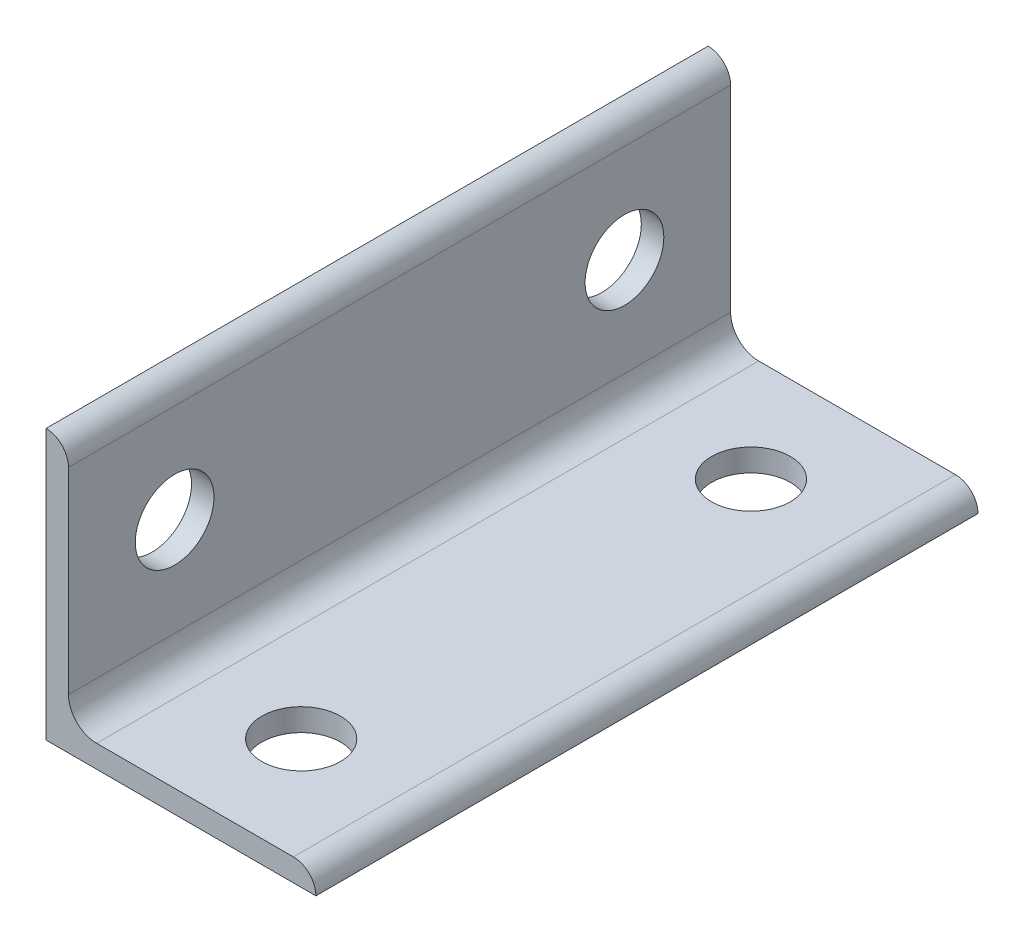
ISO-10303-21;
HEADER;
FILE_DESCRIPTION(('STEP AP214'),'2;1');
FILE_NAME('part.step','',(''),(''),'','','');
FILE_SCHEMA(('AUTOMOTIVE_DESIGN { 1 0 10303 214 1 1 1 1 }'));
ENDSEC;
DATA;
#1=APPLICATION_CONTEXT('core data for automotive mechanical design processes');
#2=APPLICATION_PROTOCOL_DEFINITION('international standard','automotive_design',2000,#1);
#3=PRODUCT_CONTEXT('',#1,'mechanical');
#4=PRODUCT('Part','Part','',(#3));
#5=PRODUCT_RELATED_PRODUCT_CATEGORY('part','',(#4));
#6=PRODUCT_DEFINITION_FORMATION('','',#4);
#7=PRODUCT_DEFINITION_CONTEXT('part definition',#1,'design');
#8=PRODUCT_DEFINITION('design','',#6,#7);
#9=PRODUCT_DEFINITION_SHAPE('','',#8);
#10=(LENGTH_UNIT() NAMED_UNIT(*) SI_UNIT(.MILLI.,.METRE.));
#11=(NAMED_UNIT(*) PLANE_ANGLE_UNIT() SI_UNIT($,.RADIAN.));
#12=(NAMED_UNIT(*) SI_UNIT($,.STERADIAN.) SOLID_ANGLE_UNIT());
#13=UNCERTAINTY_MEASURE_WITH_UNIT(LENGTH_MEASURE(1.E-05),#10,'distance_accuracy_value','');
#14=(GEOMETRIC_REPRESENTATION_CONTEXT(3) GLOBAL_UNCERTAINTY_ASSIGNED_CONTEXT((#13)) GLOBAL_UNIT_ASSIGNED_CONTEXT((#10,
#11,#12)) REPRESENTATION_CONTEXT('',''));
#15=CARTESIAN_POINT('',(0.,0.,0.));
#16=DIRECTION('',(0.,0.,1.));
#17=DIRECTION('',(1.,0.,0.));
#18=AXIS2_PLACEMENT_3D('',#15,#16,#17);
#19=CARTESIAN_POINT('',(2000.98702540289,100.584,-186.944));
#20=DIRECTION('',(0.,0.,-1.));
#21=DIRECTION('',(0.,1.,0.));
#22=AXIS2_PLACEMENT_3D('',#19,#20,#21);
#23=PLANE('',#22);
#24=DIRECTION('',(1.,0.,0.));
#25=VECTOR('',#24,1.);
#26=CARTESIAN_POINT('',(-47.62501925,0.,-186.944));
#27=LINE('',#26,#25);
#28=CARTESIAN_POINT('',(-47.62501925,0.,-186.944));
#29=VERTEX_POINT('',#28);
#30=CARTESIAN_POINT('',(28.57498075,0.,-186.944));
#31=VERTEX_POINT('',#30);
#32=EDGE_CURVE('E48',#29,#31,#27,.T.);
#33=ORIENTED_EDGE('',*,*,#32,.F.);
#34=DIRECTION('',(0.,-1.,0.));
#35=VECTOR('',#34,1.);
#36=CARTESIAN_POINT('',(-47.62501925,0.,-186.944));
#37=LINE('',#36,#35);
#38=CARTESIAN_POINT('',(-47.62501925,76.2,-186.944));
#39=VERTEX_POINT('',#38);
#40=EDGE_CURVE('E144',#39,#29,#37,.T.);
#41=ORIENTED_EDGE('',*,*,#40,.F.);
#42=CARTESIAN_POINT('',(-47.62501925,69.85,-186.944));
#43=DIRECTION('',(0.,0.,-1.));
#44=DIRECTION('',(0.,1.,0.));
#45=AXIS2_PLACEMENT_3D('',#42,#43,#44);
#46=CIRCLE('',#45,6.34999999999999);
#47=CARTESIAN_POINT('',(-41.27501925,69.85,-186.944));
#48=VERTEX_POINT('',#47);
#49=EDGE_CURVE('E149',#48,#39,#46,.F.);
#50=ORIENTED_EDGE('',*,*,#49,.F.);
#51=DIRECTION('',(0.,1.,0.));
#52=VECTOR('',#51,1.);
#53=CARTESIAN_POINT('',(-41.27501925,69.85,-186.944));
#54=LINE('',#53,#52);
#55=CARTESIAN_POINT('',(-41.27501925,14.2875,-186.944));
#56=VERTEX_POINT('',#55);
#57=EDGE_CURVE('E154',#56,#48,#54,.T.);
#58=ORIENTED_EDGE('',*,*,#57,.F.);
#59=CARTESIAN_POINT('',(-33.33751925,14.2875,-186.944));
#60=DIRECTION('',(0.,0.,-1.));
#61=DIRECTION('',(0.,1.,0.));
#62=AXIS2_PLACEMENT_3D('',#59,#60,#61);
#63=CIRCLE('',#62,7.93750000000001);
#64=CARTESIAN_POINT('',(-33.33751925,6.34999999999999,-186.944));
#65=VERTEX_POINT('',#64);
#66=EDGE_CURVE('E86',#65,#56,#63,.T.);
#67=ORIENTED_EDGE('',*,*,#66,.F.);
#68=DIRECTION('',(-1.,0.,0.));
#69=VECTOR('',#68,1.);
#70=CARTESIAN_POINT('',(22.22498075,6.35,-186.944));
#71=LINE('',#70,#69);
#72=CARTESIAN_POINT('',(22.22498075,6.35,-186.944));
#73=VERTEX_POINT('',#72);
#74=EDGE_CURVE('E91',#73,#65,#71,.T.);
#75=ORIENTED_EDGE('',*,*,#74,.F.);
#76=CARTESIAN_POINT('',(22.22498075,0.,-186.944));
#77=DIRECTION('',(0.,0.,-1.));
#78=DIRECTION('',(0.,1.,0.));
#79=AXIS2_PLACEMENT_3D('',#76,#77,#78);
#80=CIRCLE('',#79,6.35);
#81=EDGE_CURVE('E119',#31,#73,#80,.F.);
#82=ORIENTED_EDGE('',*,*,#81,.F.);
#83=EDGE_LOOP('',(#33,#41,#50,#58,#67,#75,#82));
#84=FACE_BOUND('',#83,.T.);
#85=ADVANCED_FACE('F39',(#84),#23,.T.);
#86=CARTESIAN_POINT('',(22.22498075,0.,0.));
#87=DIRECTION('',(0.,0.,-1.));
#88=DIRECTION('',(-1.,0.,0.));
#89=AXIS2_PLACEMENT_3D('',#86,#87,#88);
#90=PLANE('',#89);
#91=DIRECTION('',(1.,0.,0.));
#92=VECTOR('',#91,1.);
#93=CARTESIAN_POINT('',(-47.62501925,0.,0.));
#94=LINE('',#93,#92);
#95=CARTESIAN_POINT('',(-47.62501925,0.,0.));
#96=VERTEX_POINT('',#95);
#97=CARTESIAN_POINT('',(28.57498075,0.,0.));
#98=VERTEX_POINT('',#97);
#99=EDGE_CURVE('E131',#96,#98,#94,.T.);
#100=ORIENTED_EDGE('',*,*,#99,.T.);
#101=CARTESIAN_POINT('',(22.22498075,0.,0.));
#102=DIRECTION('',(0.,0.,1.));
#103=DIRECTION('',(-1.,0.,0.));
#104=AXIS2_PLACEMENT_3D('',#101,#102,#103);
#105=CIRCLE('',#104,6.35);
#106=CARTESIAN_POINT('',(22.22498075,6.35,0.));
#107=VERTEX_POINT('',#106);
#108=EDGE_CURVE('E117',#98,#107,#105,.T.);
#109=ORIENTED_EDGE('',*,*,#108,.T.);
#110=DIRECTION('',(-1.,0.,0.));
#111=VECTOR('',#110,1.);
#112=CARTESIAN_POINT('',(22.22498075,6.35,0.));
#113=LINE('',#112,#111);
#114=CARTESIAN_POINT('',(-33.33751925,6.34999999999998,0.));
#115=VERTEX_POINT('',#114);
#116=EDGE_CURVE('E122',#107,#115,#113,.T.);
#117=ORIENTED_EDGE('',*,*,#116,.T.);
#118=CARTESIAN_POINT('',(-33.33751925,14.2875,0.));
#119=DIRECTION('',(0.,0.,-1.));
#120=DIRECTION('',(1.,0.,0.));
#121=AXIS2_PLACEMENT_3D('',#118,#119,#120);
#122=CIRCLE('',#121,7.93750000000001);
#123=CARTESIAN_POINT('',(-41.27501925,14.2875,0.));
#124=VERTEX_POINT('',#123);
#125=EDGE_CURVE('E127',#115,#124,#122,.T.);
#126=ORIENTED_EDGE('',*,*,#125,.T.);
#127=DIRECTION('',(0.,1.,0.));
#128=VECTOR('',#127,1.);
#129=CARTESIAN_POINT('',(-41.27501925,69.85,0.));
#130=LINE('',#129,#128);
#131=CARTESIAN_POINT('',(-41.27501925,69.85,0.));
#132=VERTEX_POINT('',#131);
#133=EDGE_CURVE('E210',#124,#132,#130,.T.);
#134=ORIENTED_EDGE('',*,*,#133,.T.);
#135=CARTESIAN_POINT('',(-47.62501925,69.85,0.));
#136=DIRECTION('',(0.,0.,1.));
#137=DIRECTION('',(1.,0.,0.));
#138=AXIS2_PLACEMENT_3D('',#135,#136,#137);
#139=CIRCLE('',#138,6.34999999999999);
#140=CARTESIAN_POINT('',(-47.62501925,76.2,0.));
#141=VERTEX_POINT('',#140);
#142=EDGE_CURVE('E206',#132,#141,#139,.T.);
#143=ORIENTED_EDGE('',*,*,#142,.T.);
#144=DIRECTION('',(0.,-1.,0.));
#145=VECTOR('',#144,1.);
#146=CARTESIAN_POINT('',(-47.62501925,0.,0.));
#147=LINE('',#146,#145);
#148=EDGE_CURVE('E141',#141,#96,#147,.T.);
#149=ORIENTED_EDGE('',*,*,#148,.T.);
#150=EDGE_LOOP('',(#100,#109,#117,#126,#134,#143,#149));
#151=FACE_BOUND('',#150,.T.);
#152=ADVANCED_FACE('F129',(#151),#90,.F.);
#153=CARTESIAN_POINT('',(22.22498075,0.,-294.70707345283));
#154=DIRECTION('',(0.,0.,1.));
#155=DIRECTION('',(1.,0.,0.));
#156=AXIS2_PLACEMENT_3D('',#153,#154,#155);
#157=CYLINDRICAL_SURFACE('',#156,6.35);
#158=DIRECTION('',(0.,0.,1.));
#159=VECTOR('',#158,1.);
#160=CARTESIAN_POINT('',(28.57498075,0.,-294.70707345283));
#161=LINE('',#160,#159);
#162=EDGE_CURVE('E11',#31,#98,#161,.T.);
#163=ORIENTED_EDGE('',*,*,#162,.F.);
#164=ORIENTED_EDGE('',*,*,#81,.T.);
#165=DIRECTION('',(0.,0.,1.));
#166=VECTOR('',#165,1.);
#167=CARTESIAN_POINT('',(22.22498075,6.35,-294.70707345283));
#168=LINE('',#167,#166);
#169=EDGE_CURVE('E114',#73,#107,#168,.T.);
#170=ORIENTED_EDGE('',*,*,#169,.T.);
#171=ORIENTED_EDGE('',*,*,#108,.F.);
#172=EDGE_LOOP('',(#163,#164,#170,#171));
#173=FACE_BOUND('',#172,.T.);
#174=ADVANCED_FACE('F115',(#173),#157,.T.);
#175=CARTESIAN_POINT('',(22.22498075,6.35,-294.70707345283));
#176=DIRECTION('',(0.,1.,0.));
#177=DIRECTION('',(-1.,0.,0.));
#178=AXIS2_PLACEMENT_3D('',#175,#176,#177);
#179=PLANE('',#178);
#180=CARTESIAN_POINT('',(-5.55626924999999,6.35,-29.9719999999999));
#181=DIRECTION('',(0.,1.,0.));
#182=DIRECTION('',(-1.,0.,0.));
#183=AXIS2_PLACEMENT_3D('',#180,#181,#182);
#184=CIRCLE('',#183,11.1125);
#185=CARTESIAN_POINT('',(-16.66876925,6.34999999999999,-29.9719999999999));
#186=VERTEX_POINT('',#185);
#187=EDGE_CURVE('E172',#186,#186,#184,.T.);
#188=ORIENTED_EDGE('',*,*,#187,.F.);
#189=EDGE_LOOP('',(#188));
#190=FACE_BOUND('',#189,.T.);
#191=CARTESIAN_POINT('',(-5.55626924999999,6.35,-156.972));
#192=DIRECTION('',(0.,1.,0.));
#193=DIRECTION('',(-1.,0.,0.));
#194=AXIS2_PLACEMENT_3D('',#191,#192,#193);
#195=CIRCLE('',#194,11.1125);
#196=CARTESIAN_POINT('',(-16.66876925,6.34999999999999,-156.972));
#197=VERTEX_POINT('',#196);
#198=EDGE_CURVE('E181',#197,#197,#195,.T.);
#199=ORIENTED_EDGE('',*,*,#198,.F.);
#200=EDGE_LOOP('',(#199));
#201=FACE_BOUND('',#200,.T.);
#202=ORIENTED_EDGE('',*,*,#169,.F.);
#203=ORIENTED_EDGE('',*,*,#74,.T.);
#204=DIRECTION('',(0.,0.,1.));
#205=VECTOR('',#204,1.);
#206=CARTESIAN_POINT('',(-33.33751925,6.34999999999998,-294.70707345283));
#207=LINE('',#206,#205);
#208=EDGE_CURVE('E109',#65,#115,#207,.T.);
#209=ORIENTED_EDGE('',*,*,#208,.T.);
#210=ORIENTED_EDGE('',*,*,#116,.F.);
#211=EDGE_LOOP('',(#202,#203,#209,#210));
#212=FACE_BOUND('',#211,.T.);
#213=ADVANCED_FACE('F123',(#190,#201,#212),#179,.T.);
#214=CARTESIAN_POINT('',(-33.33751925,14.2875,-294.70707345283));
#215=DIRECTION('',(0.,0.,1.));
#216=DIRECTION('',(1.,0.,0.));
#217=AXIS2_PLACEMENT_3D('',#214,#215,#216);
#218=CYLINDRICAL_SURFACE('',#217,7.93750000000001);
#219=ORIENTED_EDGE('',*,*,#208,.F.);
#220=ORIENTED_EDGE('',*,*,#66,.T.);
#221=DIRECTION('',(0.,0.,1.));
#222=VECTOR('',#221,1.);
#223=CARTESIAN_POINT('',(-41.27501925,14.2875,-294.70707345283));
#224=LINE('',#223,#222);
#225=EDGE_CURVE('E158',#56,#124,#224,.T.);
#226=ORIENTED_EDGE('',*,*,#225,.T.);
#227=ORIENTED_EDGE('',*,*,#125,.F.);
#228=EDGE_LOOP('',(#219,#220,#226,#227));
#229=FACE_BOUND('',#228,.T.);
#230=ADVANCED_FACE('F216',(#229),#218,.F.);
#231=CARTESIAN_POINT('',(-41.27501925,69.85,-294.70707345283));
#232=DIRECTION('',(1.,0.,0.));
#233=DIRECTION('',(0.,0.,-1.));
#234=AXIS2_PLACEMENT_3D('',#231,#232,#233);
#235=PLANE('',#234);
#236=CARTESIAN_POINT('',(-41.27501925,42.06875,-29.972));
#237=DIRECTION('',(1.,0.,0.));
#238=DIRECTION('',(0.,0.,-1.));
#239=AXIS2_PLACEMENT_3D('',#236,#237,#238);
#240=CIRCLE('',#239,11.1125);
#241=CARTESIAN_POINT('',(-41.27501925,42.06875,-41.0845));
#242=VERTEX_POINT('',#241);
#243=EDGE_CURVE('E190',#242,#242,#240,.T.);
#244=ORIENTED_EDGE('',*,*,#243,.F.);
#245=EDGE_LOOP('',(#244));
#246=FACE_BOUND('',#245,.T.);
#247=CARTESIAN_POINT('',(-41.27501925,42.06875,-156.972));
#248=DIRECTION('',(1.,0.,0.));
#249=DIRECTION('',(0.,0.,-1.));
#250=AXIS2_PLACEMENT_3D('',#247,#248,#249);
#251=CIRCLE('',#250,11.1125);
#252=CARTESIAN_POINT('',(-41.27501925,42.06875,-168.0845));
#253=VERTEX_POINT('',#252);
#254=EDGE_CURVE('E135',#253,#253,#251,.T.);
#255=ORIENTED_EDGE('',*,*,#254,.F.);
#256=EDGE_LOOP('',(#255));
#257=FACE_BOUND('',#256,.T.);
#258=ORIENTED_EDGE('',*,*,#225,.F.);
#259=ORIENTED_EDGE('',*,*,#57,.T.);
#260=DIRECTION('',(0.,0.,1.));
#261=VECTOR('',#260,1.);
#262=CARTESIAN_POINT('',(-41.27501925,69.85,-294.70707345283));
#263=LINE('',#262,#261);
#264=EDGE_CURVE('E153',#48,#132,#263,.T.);
#265=ORIENTED_EDGE('',*,*,#264,.T.);
#266=ORIENTED_EDGE('',*,*,#133,.F.);
#267=EDGE_LOOP('',(#258,#259,#265,#266));
#268=FACE_BOUND('',#267,.T.);
#269=ADVANCED_FACE('F219',(#246,#257,#268),#235,.T.);
#270=CARTESIAN_POINT('',(-47.62501925,69.85,-294.70707345283));
#271=DIRECTION('',(0.,0.,1.));
#272=DIRECTION('',(1.,0.,0.));
#273=AXIS2_PLACEMENT_3D('',#270,#271,#272);
#274=CYLINDRICAL_SURFACE('',#273,6.34999999999999);
#275=ORIENTED_EDGE('',*,*,#264,.F.);
#276=ORIENTED_EDGE('',*,*,#49,.T.);
#277=DIRECTION('',(0.,0.,1.));
#278=VECTOR('',#277,1.);
#279=CARTESIAN_POINT('',(-47.62501925,76.2,-294.70707345283));
#280=LINE('',#279,#278);
#281=EDGE_CURVE('E148',#39,#141,#280,.T.);
#282=ORIENTED_EDGE('',*,*,#281,.T.);
#283=ORIENTED_EDGE('',*,*,#142,.F.);
#284=EDGE_LOOP('',(#275,#276,#282,#283));
#285=FACE_BOUND('',#284,.T.);
#286=ADVANCED_FACE('F223',(#285),#274,.T.);
#287=CARTESIAN_POINT('',(-47.62501925,0.,-294.70707345283));
#288=DIRECTION('',(-1.,0.,0.));
#289=DIRECTION('',(0.,-1.,0.));
#290=AXIS2_PLACEMENT_3D('',#287,#288,#289);
#291=PLANE('',#290);
#292=CARTESIAN_POINT('',(-47.62501925,42.06875,-29.972));
#293=DIRECTION('',(-1.,0.,0.));
#294=DIRECTION('',(0.,-1.,0.));
#295=AXIS2_PLACEMENT_3D('',#292,#293,#294);
#296=CIRCLE('',#295,11.1125);
#297=CARTESIAN_POINT('',(-47.62501925,42.06875,-41.0845));
#298=VERTEX_POINT('',#297);
#299=EDGE_CURVE('E184',#298,#298,#296,.F.);
#300=ORIENTED_EDGE('',*,*,#299,.T.);
#301=EDGE_LOOP('',(#300));
#302=FACE_BOUND('',#301,.T.);
#303=CARTESIAN_POINT('',(-47.62501925,42.06875,-156.972));
#304=DIRECTION('',(-1.,0.,0.));
#305=DIRECTION('',(0.,-1.,0.));
#306=AXIS2_PLACEMENT_3D('',#303,#304,#305);
#307=CIRCLE('',#306,11.1125);
#308=CARTESIAN_POINT('',(-47.62501925,42.06875,-168.0845));
#309=VERTEX_POINT('',#308);
#310=EDGE_CURVE('E196',#309,#309,#307,.F.);
#311=ORIENTED_EDGE('',*,*,#310,.T.);
#312=EDGE_LOOP('',(#311));
#313=FACE_BOUND('',#312,.T.);
#314=ORIENTED_EDGE('',*,*,#281,.F.);
#315=ORIENTED_EDGE('',*,*,#40,.T.);
#316=DIRECTION('',(0.,0.,1.));
#317=VECTOR('',#316,1.);
#318=CARTESIAN_POINT('',(-47.62501925,0.,-294.70707345283));
#319=LINE('',#318,#317);
#320=EDGE_CURVE('E143',#29,#96,#319,.T.);
#321=ORIENTED_EDGE('',*,*,#320,.T.);
#322=ORIENTED_EDGE('',*,*,#148,.F.);
#323=EDGE_LOOP('',(#314,#315,#321,#322));
#324=FACE_BOUND('',#323,.T.);
#325=ADVANCED_FACE('F227',(#302,#313,#324),#291,.T.);
#326=CARTESIAN_POINT('',(-47.62501925,0.,-294.70707345283));
#327=DIRECTION('',(0.,-1.,0.));
#328=DIRECTION('',(1.,0.,0.));
#329=AXIS2_PLACEMENT_3D('',#326,#327,#328);
#330=PLANE('',#329);
#331=CARTESIAN_POINT('',(-5.55626924999999,0.,-29.9719999999999));
#332=DIRECTION('',(0.,-1.,0.));
#333=DIRECTION('',(1.,0.,0.));
#334=AXIS2_PLACEMENT_3D('',#331,#332,#333);
#335=CIRCLE('',#334,11.1125);
#336=CARTESIAN_POINT('',(-16.66876925,0.,-29.9719999999999));
#337=VERTEX_POINT('',#336);
#338=EDGE_CURVE('E174',#337,#337,#335,.F.);
#339=ORIENTED_EDGE('',*,*,#338,.T.);
#340=EDGE_LOOP('',(#339));
#341=FACE_BOUND('',#340,.T.);
#342=CARTESIAN_POINT('',(-5.55626924999999,0.,-156.972));
#343=DIRECTION('',(0.,-1.,0.));
#344=DIRECTION('',(1.,0.,0.));
#345=AXIS2_PLACEMENT_3D('',#342,#343,#344);
#346=CIRCLE('',#345,11.1125);
#347=CARTESIAN_POINT('',(-16.66876925,0.,-156.972));
#348=VERTEX_POINT('',#347);
#349=EDGE_CURVE('E178',#348,#348,#346,.F.);
#350=ORIENTED_EDGE('',*,*,#349,.T.);
#351=EDGE_LOOP('',(#350));
#352=FACE_BOUND('',#351,.T.);
#353=ORIENTED_EDGE('',*,*,#320,.F.);
#354=ORIENTED_EDGE('',*,*,#32,.T.);
#355=ORIENTED_EDGE('',*,*,#162,.T.);
#356=ORIENTED_EDGE('',*,*,#99,.F.);
#357=EDGE_LOOP('',(#353,#354,#355,#356));
#358=FACE_BOUND('',#357,.T.);
#359=ADVANCED_FACE('F229',(#341,#352,#358),#330,.T.);
#360=CARTESIAN_POINT('',(-47.62601925,42.06875,-156.972));
#361=DIRECTION('',(1.,0.,0.));
#362=DIRECTION('',(0.,0.,-1.));
#363=AXIS2_PLACEMENT_3D('',#360,#361,#362);
#364=CYLINDRICAL_SURFACE('',#363,11.1125);
#365=CARTESIAN_POINT('',(-47.62501925,42.06875,-168.0845));
#366=CARTESIAN_POINT('',(-47.5588734166667,42.06875,-168.0845));
#367=CARTESIAN_POINT('',(-47.4927275833333,42.06875,-168.0845));
#368=CARTESIAN_POINT('',(-47.3604359166667,42.06875,-168.0845));
#369=CARTESIAN_POINT('',(-47.2942900833333,42.06875,-168.0845));
#370=CARTESIAN_POINT('',(-47.1619984166667,42.06875,-168.0845));
#371=CARTESIAN_POINT('',(-47.0958525833333,42.06875,-168.0845));
#372=CARTESIAN_POINT('',(-46.9635609166667,42.06875,-168.0845));
#373=CARTESIAN_POINT('',(-46.8974150833333,42.06875,-168.0845));
#374=CARTESIAN_POINT('',(-46.7651234166667,42.06875,-168.0845));
#375=CARTESIAN_POINT('',(-46.6989775833333,42.06875,-168.0845));
#376=CARTESIAN_POINT('',(-46.5666859166667,42.06875,-168.0845));
#377=CARTESIAN_POINT('',(-46.5005400833333,42.06875,-168.0845));
#378=CARTESIAN_POINT('',(-46.3682484166667,42.06875,-168.0845));
#379=CARTESIAN_POINT('',(-46.3021025833333,42.06875,-168.0845));
#380=CARTESIAN_POINT('',(-46.1698109166667,42.06875,-168.0845));
#381=CARTESIAN_POINT('',(-46.1036650833333,42.06875,-168.0845));
#382=CARTESIAN_POINT('',(-45.9713734166667,42.06875,-168.0845));
#383=CARTESIAN_POINT('',(-45.9052275833333,42.06875,-168.0845));
#384=CARTESIAN_POINT('',(-45.7729359166667,42.06875,-168.0845));
#385=CARTESIAN_POINT('',(-45.7067900833333,42.06875,-168.0845));
#386=CARTESIAN_POINT('',(-45.5744984166667,42.06875,-168.0845));
#387=CARTESIAN_POINT('',(-45.5083525833333,42.06875,-168.0845));
#388=CARTESIAN_POINT('',(-45.3760609166667,42.06875,-168.0845));
#389=CARTESIAN_POINT('',(-45.3099150833333,42.06875,-168.0845));
#390=CARTESIAN_POINT('',(-45.1776234166667,42.06875,-168.0845));
#391=CARTESIAN_POINT('',(-45.1114775833333,42.06875,-168.0845));
#392=CARTESIAN_POINT('',(-44.9791859166667,42.06875,-168.0845));
#393=CARTESIAN_POINT('',(-44.9130400833333,42.06875,-168.0845));
#394=CARTESIAN_POINT('',(-44.7807484166667,42.06875,-168.0845));
#395=CARTESIAN_POINT('',(-44.7146025833333,42.06875,-168.0845));
#396=CARTESIAN_POINT('',(-44.5823109166667,42.06875,-168.0845));
#397=CARTESIAN_POINT('',(-44.5161650833333,42.06875,-168.0845));
#398=CARTESIAN_POINT('',(-44.3838734166667,42.06875,-168.0845));
#399=CARTESIAN_POINT('',(-44.3177275833333,42.06875,-168.0845));
#400=CARTESIAN_POINT('',(-44.1854359166667,42.06875,-168.0845));
#401=CARTESIAN_POINT('',(-44.1192900833333,42.06875,-168.0845));
#402=CARTESIAN_POINT('',(-43.9869984166667,42.06875,-168.0845));
#403=CARTESIAN_POINT('',(-43.9208525833333,42.06875,-168.0845));
#404=CARTESIAN_POINT('',(-43.7885609166667,42.06875,-168.0845));
#405=CARTESIAN_POINT('',(-43.7224150833333,42.06875,-168.0845));
#406=CARTESIAN_POINT('',(-43.5901234166667,42.06875,-168.0845));
#407=CARTESIAN_POINT('',(-43.5239775833333,42.06875,-168.0845));
#408=CARTESIAN_POINT('',(-43.3916859166667,42.06875,-168.0845));
#409=CARTESIAN_POINT('',(-43.3255400833333,42.06875,-168.0845));
#410=CARTESIAN_POINT('',(-43.1932484166667,42.06875,-168.0845));
#411=CARTESIAN_POINT('',(-43.1271025833333,42.06875,-168.0845));
#412=CARTESIAN_POINT('',(-42.9948109166667,42.06875,-168.0845));
#413=CARTESIAN_POINT('',(-42.9286650833333,42.06875,-168.0845));
#414=CARTESIAN_POINT('',(-42.7963734166667,42.06875,-168.0845));
#415=CARTESIAN_POINT('',(-42.7302275833333,42.06875,-168.0845));
#416=CARTESIAN_POINT('',(-42.5979359166667,42.06875,-168.0845));
#417=CARTESIAN_POINT('',(-42.5317900833333,42.06875,-168.0845));
#418=CARTESIAN_POINT('',(-42.3994984166667,42.06875,-168.0845));
#419=CARTESIAN_POINT('',(-42.3333525833333,42.06875,-168.0845));
#420=CARTESIAN_POINT('',(-42.2010609166667,42.06875,-168.0845));
#421=CARTESIAN_POINT('',(-42.1349150833333,42.06875,-168.0845));
#422=CARTESIAN_POINT('',(-42.0026234166667,42.06875,-168.0845));
#423=CARTESIAN_POINT('',(-41.9364775833333,42.06875,-168.0845));
#424=CARTESIAN_POINT('',(-41.8041859166667,42.06875,-168.0845));
#425=CARTESIAN_POINT('',(-41.7380400833333,42.06875,-168.0845));
#426=CARTESIAN_POINT('',(-41.6057484166667,42.06875,-168.0845));
#427=CARTESIAN_POINT('',(-41.5396025833333,42.06875,-168.0845));
#428=CARTESIAN_POINT('',(-41.4073109166667,42.06875,-168.0845));
#429=CARTESIAN_POINT('',(-41.3411650833333,42.06875,-168.0845));
#430=CARTESIAN_POINT('',(-41.27501925,42.06875,-168.0845));
#431=B_SPLINE_CURVE_WITH_KNOTS('',3,(#365,#366,#367,#368,#369,#370,#371,#372,#373,#374,#375,
#376,#377,#378,#379,#380,#381,#382,#383,#384,#385,#386,#387,#388,#389,#390,#391,#392,#393,#394,
#395,#396,#397,#398,#399,#400,#401,#402,#403,#404,#405,#406,#407,#408,#409,#410,#411,#412,#413,
#414,#415,#416,#417,#418,#419,#420,#421,#422,#423,#424,#425,#426,#427,#428,#429,#430),
.UNSPECIFIED.,.F.,.F.,(4,2,2,2,2,2,2,2,2,2,2,2,2,2,2,2,2,2,2,2,2,2,2,2,2,2,2,2,2,2,2,2,4),(0.,
0.198437500000002,0.396875000000005,0.5953125,0.793750000000003,0.992187500000005,1.190625,
1.3890625,1.5875,1.7859375,1.984375,2.1828125,2.38125,2.5796875,2.778125,2.9765625,3.175,
3.3734375,3.571875,3.7703125,3.96875,4.1671875,4.365625,4.5640625,4.7625,4.9609375,5.159375,
5.3578125,5.55625,5.7546875,5.953125,6.1515625,6.34999999999999),.UNSPECIFIED.);
#432=EDGE_CURVE('BSEAM231',#309,#253,#431,.T.);
#433=ORIENTED_EDGE('',*,*,#310,.F.);
#434=ORIENTED_EDGE('',*,*,#254,.T.);
#435=ORIENTED_EDGE('',*,*,#432,.T.);
#436=ORIENTED_EDGE('',*,*,#432,.F.);
#437=EDGE_LOOP('',(#433,#435,#434,#436));
#438=FACE_BOUND('',#437,.T.);
#439=ADVANCED_FACE('F231',(#438),#364,.F.);
#440=CARTESIAN_POINT('',(-47.62601925,42.06875,-29.972));
#441=DIRECTION('',(1.,0.,0.));
#442=DIRECTION('',(0.,0.,-1.));
#443=AXIS2_PLACEMENT_3D('',#440,#441,#442);
#444=CYLINDRICAL_SURFACE('',#443,11.1125);
#445=CARTESIAN_POINT('',(-47.62501925,42.06875,-41.0845));
#446=CARTESIAN_POINT('',(-47.5588734166667,42.06875,-41.0845));
#447=CARTESIAN_POINT('',(-47.4927275833333,42.06875,-41.0845));
#448=CARTESIAN_POINT('',(-47.3604359166667,42.06875,-41.0845));
#449=CARTESIAN_POINT('',(-47.2942900833333,42.06875,-41.0845));
#450=CARTESIAN_POINT('',(-47.1619984166667,42.06875,-41.0845));
#451=CARTESIAN_POINT('',(-47.0958525833333,42.06875,-41.0845));
#452=CARTESIAN_POINT('',(-46.9635609166667,42.06875,-41.0845));
#453=CARTESIAN_POINT('',(-46.8974150833333,42.06875,-41.0845));
#454=CARTESIAN_POINT('',(-46.7651234166667,42.06875,-41.0845));
#455=CARTESIAN_POINT('',(-46.6989775833333,42.06875,-41.0845));
#456=CARTESIAN_POINT('',(-46.5666859166667,42.06875,-41.0845));
#457=CARTESIAN_POINT('',(-46.5005400833333,42.06875,-41.0845));
#458=CARTESIAN_POINT('',(-46.3682484166667,42.06875,-41.0845));
#459=CARTESIAN_POINT('',(-46.3021025833333,42.06875,-41.0845));
#460=CARTESIAN_POINT('',(-46.1698109166667,42.06875,-41.0845));
#461=CARTESIAN_POINT('',(-46.1036650833333,42.06875,-41.0845));
#462=CARTESIAN_POINT('',(-45.9713734166667,42.06875,-41.0845));
#463=CARTESIAN_POINT('',(-45.9052275833333,42.06875,-41.0845));
#464=CARTESIAN_POINT('',(-45.7729359166667,42.06875,-41.0845));
#465=CARTESIAN_POINT('',(-45.7067900833333,42.06875,-41.0845));
#466=CARTESIAN_POINT('',(-45.5744984166667,42.06875,-41.0845));
#467=CARTESIAN_POINT('',(-45.5083525833333,42.06875,-41.0845));
#468=CARTESIAN_POINT('',(-45.3760609166667,42.06875,-41.0845));
#469=CARTESIAN_POINT('',(-45.3099150833333,42.06875,-41.0845));
#470=CARTESIAN_POINT('',(-45.1776234166667,42.06875,-41.0845));
#471=CARTESIAN_POINT('',(-45.1114775833333,42.06875,-41.0845));
#472=CARTESIAN_POINT('',(-44.9791859166667,42.06875,-41.0845));
#473=CARTESIAN_POINT('',(-44.9130400833333,42.06875,-41.0845));
#474=CARTESIAN_POINT('',(-44.7807484166667,42.06875,-41.0845));
#475=CARTESIAN_POINT('',(-44.7146025833333,42.06875,-41.0845));
#476=CARTESIAN_POINT('',(-44.5823109166667,42.06875,-41.0845));
#477=CARTESIAN_POINT('',(-44.5161650833333,42.06875,-41.0845));
#478=CARTESIAN_POINT('',(-44.3838734166667,42.06875,-41.0845));
#479=CARTESIAN_POINT('',(-44.3177275833333,42.06875,-41.0845));
#480=CARTESIAN_POINT('',(-44.1854359166667,42.06875,-41.0845));
#481=CARTESIAN_POINT('',(-44.1192900833333,42.06875,-41.0845));
#482=CARTESIAN_POINT('',(-43.9869984166667,42.06875,-41.0845));
#483=CARTESIAN_POINT('',(-43.9208525833333,42.06875,-41.0845));
#484=CARTESIAN_POINT('',(-43.7885609166667,42.06875,-41.0845));
#485=CARTESIAN_POINT('',(-43.7224150833333,42.06875,-41.0845));
#486=CARTESIAN_POINT('',(-43.5901234166667,42.06875,-41.0845));
#487=CARTESIAN_POINT('',(-43.5239775833333,42.06875,-41.0845));
#488=CARTESIAN_POINT('',(-43.3916859166667,42.06875,-41.0845));
#489=CARTESIAN_POINT('',(-43.3255400833333,42.06875,-41.0845));
#490=CARTESIAN_POINT('',(-43.1932484166667,42.06875,-41.0845));
#491=CARTESIAN_POINT('',(-43.1271025833333,42.06875,-41.0845));
#492=CARTESIAN_POINT('',(-42.9948109166667,42.06875,-41.0845));
#493=CARTESIAN_POINT('',(-42.9286650833333,42.06875,-41.0845));
#494=CARTESIAN_POINT('',(-42.7963734166667,42.06875,-41.0845));
#495=CARTESIAN_POINT('',(-42.7302275833333,42.06875,-41.0845));
#496=CARTESIAN_POINT('',(-42.5979359166667,42.06875,-41.0845));
#497=CARTESIAN_POINT('',(-42.5317900833333,42.06875,-41.0845));
#498=CARTESIAN_POINT('',(-42.3994984166667,42.06875,-41.0845));
#499=CARTESIAN_POINT('',(-42.3333525833333,42.06875,-41.0845));
#500=CARTESIAN_POINT('',(-42.2010609166667,42.06875,-41.0845));
#501=CARTESIAN_POINT('',(-42.1349150833333,42.06875,-41.0845));
#502=CARTESIAN_POINT('',(-42.0026234166667,42.06875,-41.0845));
#503=CARTESIAN_POINT('',(-41.9364775833333,42.06875,-41.0845));
#504=CARTESIAN_POINT('',(-41.8041859166667,42.06875,-41.0845));
#505=CARTESIAN_POINT('',(-41.7380400833333,42.06875,-41.0845));
#506=CARTESIAN_POINT('',(-41.6057484166667,42.06875,-41.0845));
#507=CARTESIAN_POINT('',(-41.5396025833333,42.06875,-41.0845));
#508=CARTESIAN_POINT('',(-41.4073109166667,42.06875,-41.0845));
#509=CARTESIAN_POINT('',(-41.3411650833333,42.06875,-41.0845));
#510=CARTESIAN_POINT('',(-41.27501925,42.06875,-41.0845));
#511=B_SPLINE_CURVE_WITH_KNOTS('',3,(#445,#446,#447,#448,#449,#450,#451,#452,#453,#454,#455,
#456,#457,#458,#459,#460,#461,#462,#463,#464,#465,#466,#467,#468,#469,#470,#471,#472,#473,#474,
#475,#476,#477,#478,#479,#480,#481,#482,#483,#484,#485,#486,#487,#488,#489,#490,#491,#492,#493,
#494,#495,#496,#497,#498,#499,#500,#501,#502,#503,#504,#505,#506,#507,#508,#509,#510),
.UNSPECIFIED.,.F.,.F.,(4,2,2,2,2,2,2,2,2,2,2,2,2,2,2,2,2,2,2,2,2,2,2,2,2,2,2,2,2,2,2,2,4),(0.,
0.198437500000002,0.396875000000005,0.5953125,0.793750000000003,0.992187500000005,1.190625,
1.3890625,1.5875,1.7859375,1.984375,2.1828125,2.38125,2.5796875,2.778125,2.9765625,3.175,
3.3734375,3.571875,3.7703125,3.96875,4.1671875,4.365625,4.5640625,4.7625,4.9609375,5.159375,
5.3578125,5.55625,5.7546875,5.953125,6.1515625,6.34999999999999),.UNSPECIFIED.);
#512=EDGE_CURVE('BSEAM238',#298,#242,#511,.T.);
#513=ORIENTED_EDGE('',*,*,#299,.F.);
#514=ORIENTED_EDGE('',*,*,#243,.T.);
#515=ORIENTED_EDGE('',*,*,#512,.T.);
#516=ORIENTED_EDGE('',*,*,#512,.F.);
#517=EDGE_LOOP('',(#513,#515,#514,#516));
#518=FACE_BOUND('',#517,.T.);
#519=ADVANCED_FACE('F238',(#518),#444,.F.);
#520=CARTESIAN_POINT('',(-5.55626924999999,-0.00100000000000967,-156.972));
#521=DIRECTION('',(0.,1.,0.));
#522=DIRECTION('',(-1.,0.,0.));
#523=AXIS2_PLACEMENT_3D('',#520,#521,#522);
#524=CYLINDRICAL_SURFACE('',#523,11.1125);
#525=CARTESIAN_POINT('',(-16.66876925,0.,-156.972));
#526=CARTESIAN_POINT('',(-16.66876925,0.0661458333333323,-156.972));
#527=CARTESIAN_POINT('',(-16.66876925,0.132291666666666,-156.972));
#528=CARTESIAN_POINT('',(-16.66876925,0.264583333333332,-156.972));
#529=CARTESIAN_POINT('',(-16.66876925,0.330729166666665,-156.972));
#530=CARTESIAN_POINT('',(-16.66876925,0.463020833333332,-156.972));
#531=CARTESIAN_POINT('',(-16.66876925,0.529166666666665,-156.972));
#532=CARTESIAN_POINT('',(-16.66876925,0.661458333333332,-156.972));
#533=CARTESIAN_POINT('',(-16.66876925,0.727604166666665,-156.972));
#534=CARTESIAN_POINT('',(-16.66876925,0.859895833333332,-156.972));
#535=CARTESIAN_POINT('',(-16.66876925,0.926041666666665,-156.972));
#536=CARTESIAN_POINT('',(-16.66876925,1.05833333333333,-156.972));
#537=CARTESIAN_POINT('',(-16.66876925,1.12447916666666,-156.972));
#538=CARTESIAN_POINT('',(-16.66876925,1.25677083333333,-156.972));
#539=CARTESIAN_POINT('',(-16.66876925,1.32291666666666,-156.972));
#540=CARTESIAN_POINT('',(-16.66876925,1.45520833333333,-156.972));
#541=CARTESIAN_POINT('',(-16.66876925,1.52135416666666,-156.972));
#542=CARTESIAN_POINT('',(-16.66876925,1.65364583333333,-156.972));
#543=CARTESIAN_POINT('',(-16.66876925,1.71979166666666,-156.972));
#544=CARTESIAN_POINT('',(-16.66876925,1.85208333333333,-156.972));
#545=CARTESIAN_POINT('',(-16.66876925,1.91822916666666,-156.972));
#546=CARTESIAN_POINT('',(-16.66876925,2.05052083333333,-156.972));
#547=CARTESIAN_POINT('',(-16.66876925,2.11666666666666,-156.972));
#548=CARTESIAN_POINT('',(-16.66876925,2.24895833333333,-156.972));
#549=CARTESIAN_POINT('',(-16.66876925,2.31510416666666,-156.972));
#550=CARTESIAN_POINT('',(-16.66876925,2.44739583333333,-156.972));
#551=CARTESIAN_POINT('',(-16.66876925,2.51354166666666,-156.972));
#552=CARTESIAN_POINT('',(-16.66876925,2.64583333333333,-156.972));
#553=CARTESIAN_POINT('',(-16.66876925,2.71197916666666,-156.972));
#554=CARTESIAN_POINT('',(-16.66876925,2.84427083333333,-156.972));
#555=CARTESIAN_POINT('',(-16.66876925,2.91041666666666,-156.972));
#556=CARTESIAN_POINT('',(-16.66876925,3.04270833333333,-156.972));
#557=CARTESIAN_POINT('',(-16.66876925,3.10885416666666,-156.972));
#558=CARTESIAN_POINT('',(-16.66876925,3.24114583333333,-156.972));
#559=CARTESIAN_POINT('',(-16.66876925,3.30729166666666,-156.972));
#560=CARTESIAN_POINT('',(-16.66876925,3.43958333333333,-156.972));
#561=CARTESIAN_POINT('',(-16.66876925,3.50572916666666,-156.972));
#562=CARTESIAN_POINT('',(-16.66876925,3.63802083333333,-156.972));
#563=CARTESIAN_POINT('',(-16.66876925,3.70416666666666,-156.972));
#564=CARTESIAN_POINT('',(-16.66876925,3.83645833333333,-156.972));
#565=CARTESIAN_POINT('',(-16.66876925,3.90260416666666,-156.972));
#566=CARTESIAN_POINT('',(-16.66876925,4.03489583333333,-156.972));
#567=CARTESIAN_POINT('',(-16.66876925,4.10104166666666,-156.972));
#568=CARTESIAN_POINT('',(-16.66876925,4.23333333333333,-156.972));
#569=CARTESIAN_POINT('',(-16.66876925,4.29947916666666,-156.972));
#570=CARTESIAN_POINT('',(-16.66876925,4.43177083333333,-156.972));
#571=CARTESIAN_POINT('',(-16.66876925,4.49791666666666,-156.972));
#572=CARTESIAN_POINT('',(-16.66876925,4.63020833333333,-156.972));
#573=CARTESIAN_POINT('',(-16.66876925,4.69635416666666,-156.972));
#574=CARTESIAN_POINT('',(-16.66876925,4.82864583333333,-156.972));
#575=CARTESIAN_POINT('',(-16.66876925,4.89479166666666,-156.972));
#576=CARTESIAN_POINT('',(-16.66876925,5.02708333333333,-156.972));
#577=CARTESIAN_POINT('',(-16.66876925,5.09322916666666,-156.972));
#578=CARTESIAN_POINT('',(-16.66876925,5.22552083333333,-156.972));
#579=CARTESIAN_POINT('',(-16.66876925,5.29166666666666,-156.972));
#580=CARTESIAN_POINT('',(-16.66876925,5.42395833333333,-156.972));
#581=CARTESIAN_POINT('',(-16.66876925,5.49010416666666,-156.972));
#582=CARTESIAN_POINT('',(-16.66876925,5.62239583333333,-156.972));
#583=CARTESIAN_POINT('',(-16.66876925,5.68854166666666,-156.972));
#584=CARTESIAN_POINT('',(-16.66876925,5.82083333333333,-156.972));
#585=CARTESIAN_POINT('',(-16.66876925,5.88697916666666,-156.972));
#586=CARTESIAN_POINT('',(-16.66876925,6.01927083333333,-156.972));
#587=CARTESIAN_POINT('',(-16.66876925,6.08541666666666,-156.972));
#588=CARTESIAN_POINT('',(-16.66876925,6.21770833333333,-156.972));
#589=CARTESIAN_POINT('',(-16.66876925,6.28385416666666,-156.972));
#590=CARTESIAN_POINT('',(-16.66876925,6.34999999999999,-156.972));
#591=B_SPLINE_CURVE_WITH_KNOTS('',3,(#525,#526,#527,#528,#529,#530,#531,#532,#533,#534,#535,
#536,#537,#538,#539,#540,#541,#542,#543,#544,#545,#546,#547,#548,#549,#550,#551,#552,#553,#554,
#555,#556,#557,#558,#559,#560,#561,#562,#563,#564,#565,#566,#567,#568,#569,#570,#571,#572,#573,
#574,#575,#576,#577,#578,#579,#580,#581,#582,#583,#584,#585,#586,#587,#588,#589,#590),
.UNSPECIFIED.,.F.,.F.,(4,2,2,2,2,2,2,2,2,2,2,2,2,2,2,2,2,2,2,2,2,2,2,2,2,2,2,2,2,2,2,2,4),(0.,
0.1984375,0.396875,0.595312499999999,0.793749999999999,0.992187499999999,1.190625,1.3890625,
1.5875,1.7859375,1.984375,2.1828125,2.38125,2.5796875,2.778125,2.9765625,3.175,3.3734375,
3.571875,3.7703125,3.96875,4.1671875,4.365625,4.5640625,4.7625,4.9609375,5.159375,5.3578125,
5.55625,5.75468749999999,5.95312499999999,6.15156249999999,6.34999999999999),.UNSPECIFIED.);
#592=EDGE_CURVE('BSEAM255',#348,#197,#591,.T.);
#593=ORIENTED_EDGE('',*,*,#349,.F.);
#594=ORIENTED_EDGE('',*,*,#198,.T.);
#595=ORIENTED_EDGE('',*,*,#592,.T.);
#596=ORIENTED_EDGE('',*,*,#592,.F.);
#597=EDGE_LOOP('',(#593,#595,#594,#596));
#598=FACE_BOUND('',#597,.T.);
#599=ADVANCED_FACE('F255',(#598),#524,.F.);
#600=CARTESIAN_POINT('',(-5.55626924999999,-0.00100000000000967,-29.9719999999999));
#601=DIRECTION('',(0.,1.,0.));
#602=DIRECTION('',(-1.,0.,0.));
#603=AXIS2_PLACEMENT_3D('',#600,#601,#602);
#604=CYLINDRICAL_SURFACE('',#603,11.1125);
#605=CARTESIAN_POINT('',(-16.66876925,0.,-29.9719999999999));
#606=CARTESIAN_POINT('',(-16.66876925,0.0661458333333323,-29.9719999999999));
#607=CARTESIAN_POINT('',(-16.66876925,0.132291666666666,-29.9719999999999));
#608=CARTESIAN_POINT('',(-16.66876925,0.264583333333332,-29.9719999999999));
#609=CARTESIAN_POINT('',(-16.66876925,0.330729166666665,-29.9719999999999));
#610=CARTESIAN_POINT('',(-16.66876925,0.463020833333332,-29.9719999999999));
#611=CARTESIAN_POINT('',(-16.66876925,0.529166666666665,-29.9719999999999));
#612=CARTESIAN_POINT('',(-16.66876925,0.661458333333332,-29.9719999999999));
#613=CARTESIAN_POINT('',(-16.66876925,0.727604166666665,-29.9719999999999));
#614=CARTESIAN_POINT('',(-16.66876925,0.859895833333332,-29.9719999999999));
#615=CARTESIAN_POINT('',(-16.66876925,0.926041666666665,-29.9719999999999));
#616=CARTESIAN_POINT('',(-16.66876925,1.05833333333333,-29.9719999999999));
#617=CARTESIAN_POINT('',(-16.66876925,1.12447916666666,-29.9719999999999));
#618=CARTESIAN_POINT('',(-16.66876925,1.25677083333333,-29.9719999999999));
#619=CARTESIAN_POINT('',(-16.66876925,1.32291666666666,-29.9719999999999));
#620=CARTESIAN_POINT('',(-16.66876925,1.45520833333333,-29.9719999999999));
#621=CARTESIAN_POINT('',(-16.66876925,1.52135416666666,-29.9719999999999));
#622=CARTESIAN_POINT('',(-16.66876925,1.65364583333333,-29.9719999999999));
#623=CARTESIAN_POINT('',(-16.66876925,1.71979166666666,-29.9719999999999));
#624=CARTESIAN_POINT('',(-16.66876925,1.85208333333333,-29.9719999999999));
#625=CARTESIAN_POINT('',(-16.66876925,1.91822916666666,-29.9719999999999));
#626=CARTESIAN_POINT('',(-16.66876925,2.05052083333333,-29.9719999999999));
#627=CARTESIAN_POINT('',(-16.66876925,2.11666666666666,-29.9719999999999));
#628=CARTESIAN_POINT('',(-16.66876925,2.24895833333333,-29.9719999999999));
#629=CARTESIAN_POINT('',(-16.66876925,2.31510416666666,-29.9719999999999));
#630=CARTESIAN_POINT('',(-16.66876925,2.44739583333333,-29.9719999999999));
#631=CARTESIAN_POINT('',(-16.66876925,2.51354166666666,-29.9719999999999));
#632=CARTESIAN_POINT('',(-16.66876925,2.64583333333333,-29.9719999999999));
#633=CARTESIAN_POINT('',(-16.66876925,2.71197916666666,-29.9719999999999));
#634=CARTESIAN_POINT('',(-16.66876925,2.84427083333333,-29.9719999999999));
#635=CARTESIAN_POINT('',(-16.66876925,2.91041666666666,-29.9719999999999));
#636=CARTESIAN_POINT('',(-16.66876925,3.04270833333333,-29.9719999999999));
#637=CARTESIAN_POINT('',(-16.66876925,3.10885416666666,-29.9719999999999));
#638=CARTESIAN_POINT('',(-16.66876925,3.24114583333333,-29.9719999999999));
#639=CARTESIAN_POINT('',(-16.66876925,3.30729166666666,-29.9719999999999));
#640=CARTESIAN_POINT('',(-16.66876925,3.43958333333333,-29.9719999999999));
#641=CARTESIAN_POINT('',(-16.66876925,3.50572916666666,-29.9719999999999));
#642=CARTESIAN_POINT('',(-16.66876925,3.63802083333333,-29.9719999999999));
#643=CARTESIAN_POINT('',(-16.66876925,3.70416666666666,-29.9719999999999));
#644=CARTESIAN_POINT('',(-16.66876925,3.83645833333333,-29.9719999999999));
#645=CARTESIAN_POINT('',(-16.66876925,3.90260416666666,-29.9719999999999));
#646=CARTESIAN_POINT('',(-16.66876925,4.03489583333333,-29.9719999999999));
#647=CARTESIAN_POINT('',(-16.66876925,4.10104166666666,-29.9719999999999));
#648=CARTESIAN_POINT('',(-16.66876925,4.23333333333333,-29.9719999999999));
#649=CARTESIAN_POINT('',(-16.66876925,4.29947916666666,-29.9719999999999));
#650=CARTESIAN_POINT('',(-16.66876925,4.43177083333333,-29.9719999999999));
#651=CARTESIAN_POINT('',(-16.66876925,4.49791666666666,-29.9719999999999));
#652=CARTESIAN_POINT('',(-16.66876925,4.63020833333333,-29.9719999999999));
#653=CARTESIAN_POINT('',(-16.66876925,4.69635416666666,-29.9719999999999));
#654=CARTESIAN_POINT('',(-16.66876925,4.82864583333333,-29.9719999999999));
#655=CARTESIAN_POINT('',(-16.66876925,4.89479166666666,-29.9719999999999));
#656=CARTESIAN_POINT('',(-16.66876925,5.02708333333333,-29.9719999999999));
#657=CARTESIAN_POINT('',(-16.66876925,5.09322916666666,-29.9719999999999));
#658=CARTESIAN_POINT('',(-16.66876925,5.22552083333333,-29.9719999999999));
#659=CARTESIAN_POINT('',(-16.66876925,5.29166666666666,-29.9719999999999));
#660=CARTESIAN_POINT('',(-16.66876925,5.42395833333333,-29.9719999999999));
#661=CARTESIAN_POINT('',(-16.66876925,5.49010416666666,-29.9719999999999));
#662=CARTESIAN_POINT('',(-16.66876925,5.62239583333333,-29.9719999999999));
#663=CARTESIAN_POINT('',(-16.66876925,5.68854166666666,-29.9719999999999));
#664=CARTESIAN_POINT('',(-16.66876925,5.82083333333333,-29.9719999999999));
#665=CARTESIAN_POINT('',(-16.66876925,5.88697916666666,-29.9719999999999));
#666=CARTESIAN_POINT('',(-16.66876925,6.01927083333333,-29.9719999999999));
#667=CARTESIAN_POINT('',(-16.66876925,6.08541666666666,-29.9719999999999));
#668=CARTESIAN_POINT('',(-16.66876925,6.21770833333333,-29.9719999999999));
#669=CARTESIAN_POINT('',(-16.66876925,6.28385416666666,-29.9719999999999));
#670=CARTESIAN_POINT('',(-16.66876925,6.34999999999999,-29.9719999999999));
#671=B_SPLINE_CURVE_WITH_KNOTS('',3,(#605,#606,#607,#608,#609,#610,#611,#612,#613,#614,#615,
#616,#617,#618,#619,#620,#621,#622,#623,#624,#625,#626,#627,#628,#629,#630,#631,#632,#633,#634,
#635,#636,#637,#638,#639,#640,#641,#642,#643,#644,#645,#646,#647,#648,#649,#650,#651,#652,#653,
#654,#655,#656,#657,#658,#659,#660,#661,#662,#663,#664,#665,#666,#667,#668,#669,#670),
.UNSPECIFIED.,.F.,.F.,(4,2,2,2,2,2,2,2,2,2,2,2,2,2,2,2,2,2,2,2,2,2,2,2,2,2,2,2,2,2,2,2,4),(0.,
0.1984375,0.396875,0.595312499999999,0.793749999999999,0.992187499999999,1.190625,1.3890625,
1.5875,1.7859375,1.984375,2.1828125,2.38125,2.5796875,2.778125,2.9765625,3.175,3.3734375,
3.571875,3.7703125,3.96875,4.1671875,4.365625,4.5640625,4.7625,4.9609375,5.159375,5.3578125,
5.55625,5.75468749999999,5.95312499999999,6.15156249999999,6.34999999999999),.UNSPECIFIED.);
#672=EDGE_CURVE('BSEAM259',#337,#186,#671,.T.);
#673=ORIENTED_EDGE('',*,*,#338,.F.);
#674=ORIENTED_EDGE('',*,*,#187,.T.);
#675=ORIENTED_EDGE('',*,*,#672,.T.);
#676=ORIENTED_EDGE('',*,*,#672,.F.);
#677=EDGE_LOOP('',(#673,#675,#674,#676));
#678=FACE_BOUND('',#677,.T.);
#679=ADVANCED_FACE('F259',(#678),#604,.F.);
#680=CLOSED_SHELL('',(#85,#152,#174,#213,#230,#269,#286,#325,#359,#439,#519,#599,#679));
#681=MANIFOLD_SOLID_BREP('B2',#680);
#682=ADVANCED_BREP_SHAPE_REPRESENTATION('',(#18,#681),#14);
#683=SHAPE_DEFINITION_REPRESENTATION(#9,#682);
ENDSEC;
END-ISO-10303-21;
